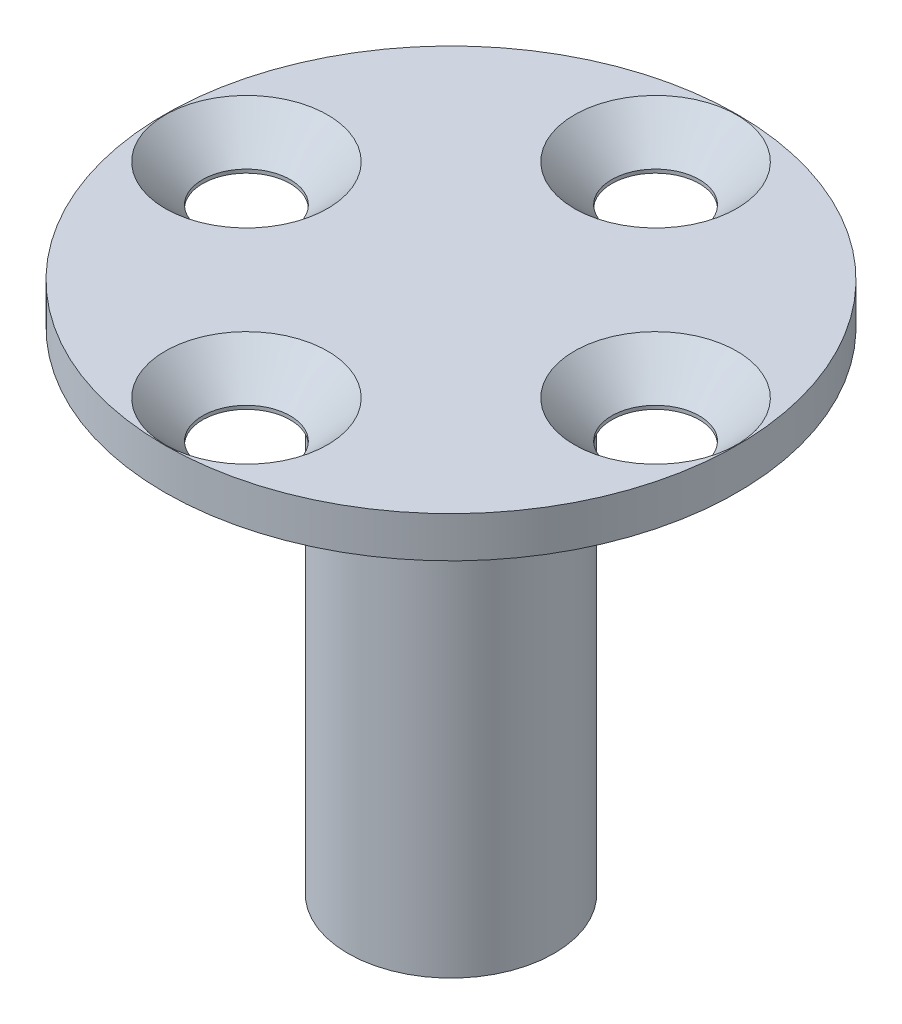
ISO-10303-21;
HEADER;
FILE_DESCRIPTION(('STEP AP214'),'2;1');
FILE_NAME('part.step','',(''),(''),'','','');
FILE_SCHEMA(('AUTOMOTIVE_DESIGN { 1 0 10303 214 1 1 1 1 }'));
ENDSEC;
DATA;
#1=APPLICATION_CONTEXT('core data for automotive mechanical design processes');
#2=APPLICATION_PROTOCOL_DEFINITION('international standard','automotive_design',2000,#1);
#3=PRODUCT_CONTEXT('',#1,'mechanical');
#4=PRODUCT('Part','Part','',(#3));
#5=PRODUCT_RELATED_PRODUCT_CATEGORY('part','',(#4));
#6=PRODUCT_DEFINITION_FORMATION('','',#4);
#7=PRODUCT_DEFINITION_CONTEXT('part definition',#1,'design');
#8=PRODUCT_DEFINITION('design','',#6,#7);
#9=PRODUCT_DEFINITION_SHAPE('','',#8);
#10=(LENGTH_UNIT() NAMED_UNIT(*) SI_UNIT(.MILLI.,.METRE.));
#11=(NAMED_UNIT(*) PLANE_ANGLE_UNIT() SI_UNIT($,.RADIAN.));
#12=(NAMED_UNIT(*) SI_UNIT($,.STERADIAN.) SOLID_ANGLE_UNIT());
#13=UNCERTAINTY_MEASURE_WITH_UNIT(LENGTH_MEASURE(1.E-05),#10,'distance_accuracy_value','');
#14=(GEOMETRIC_REPRESENTATION_CONTEXT(3) GLOBAL_UNCERTAINTY_ASSIGNED_CONTEXT((#13)) GLOBAL_UNIT_ASSIGNED_CONTEXT((#10,
#11,#12)) REPRESENTATION_CONTEXT('',''));
#15=CARTESIAN_POINT('',(0.,0.,0.));
#16=DIRECTION('',(0.,0.,1.));
#17=DIRECTION('',(1.,0.,0.));
#18=AXIS2_PLACEMENT_3D('',#15,#16,#17);
#19=CARTESIAN_POINT('',(0.,3.175,0.));
#20=DIRECTION('',(0.,-1.,0.));
#21=DIRECTION('',(0.,0.,-1.));
#22=AXIS2_PLACEMENT_3D('',#19,#20,#21);
#23=CYLINDRICAL_SURFACE('',#22,11.1125);
#24=CARTESIAN_POINT('',(0.,0.,0.));
#25=DIRECTION('',(0.,1.,0.));
#26=DIRECTION('',(0.,0.,1.));
#27=AXIS2_PLACEMENT_3D('',#24,#25,#26);
#28=CIRCLE('',#27,11.1125);
#29=CARTESIAN_POINT('',(0.,0.,11.1125));
#30=VERTEX_POINT('',#29);
#31=EDGE_CURVE('E41',#30,#30,#28,.T.);
#32=ORIENTED_EDGE('',*,*,#31,.T.);
#33=EDGE_LOOP('',(#32));
#34=FACE_BOUND('',#33,.T.);
#35=CARTESIAN_POINT('',(0.,1.5875,0.));
#36=DIRECTION('',(0.,1.,0.));
#37=DIRECTION('',(0.,0.,1.));
#38=AXIS2_PLACEMENT_3D('',#35,#36,#37);
#39=CIRCLE('',#38,11.1125);
#40=CARTESIAN_POINT('',(0.,1.5875,11.1125));
#41=VERTEX_POINT('',#40);
#42=EDGE_CURVE('E45',#41,#41,#39,.T.);
#43=ORIENTED_EDGE('',*,*,#42,.F.);
#44=EDGE_LOOP('',(#43));
#45=FACE_BOUND('',#44,.T.);
#46=ADVANCED_FACE('F30',(#34,#45),#23,.T.);
#47=CARTESIAN_POINT('',(0.,-19.05,0.));
#48=DIRECTION('',(0.,1.,0.));
#49=DIRECTION('',(0.,0.,1.));
#50=AXIS2_PLACEMENT_3D('',#47,#48,#49);
#51=CYLINDRICAL_SURFACE('',#50,4.);
#52=CARTESIAN_POINT('',(0.,-19.05,0.));
#53=DIRECTION('',(0.,1.,0.));
#54=DIRECTION('',(0.,0.,1.));
#55=AXIS2_PLACEMENT_3D('',#52,#53,#54);
#56=CIRCLE('',#55,4.);
#57=CARTESIAN_POINT('',(0.,-19.05,4.));
#58=VERTEX_POINT('',#57);
#59=EDGE_CURVE('E10',#58,#58,#56,.T.);
#60=CARTESIAN_POINT('',(0.,0.,0.));
#61=DIRECTION('',(0.,1.,0.));
#62=DIRECTION('',(0.,0.,1.));
#63=AXIS2_PLACEMENT_3D('',#60,#61,#62);
#64=CIRCLE('',#63,4.);
#65=CARTESIAN_POINT('',(0.,0.,4.));
#66=VERTEX_POINT('',#65);
#67=EDGE_CURVE('E34',#66,#66,#64,.T.);
#68=CARTESIAN_POINT('',(0.,-19.05,4.));
#69=CARTESIAN_POINT('',(0.,-18.8515625,4.));
#70=CARTESIAN_POINT('',(0.,-18.653125,4.));
#71=CARTESIAN_POINT('',(0.,-18.25625,4.));
#72=CARTESIAN_POINT('',(0.,-18.0578125,4.));
#73=CARTESIAN_POINT('',(0.,-17.6609375,4.));
#74=CARTESIAN_POINT('',(0.,-17.4625,4.));
#75=CARTESIAN_POINT('',(0.,-17.065625,4.));
#76=CARTESIAN_POINT('',(0.,-16.8671875,4.));
#77=CARTESIAN_POINT('',(0.,-16.4703125,4.));
#78=CARTESIAN_POINT('',(0.,-16.271875,4.));
#79=CARTESIAN_POINT('',(0.,-15.875,4.));
#80=CARTESIAN_POINT('',(0.,-15.6765625,4.));
#81=CARTESIAN_POINT('',(0.,-15.2796875,4.));
#82=CARTESIAN_POINT('',(0.,-15.08125,4.));
#83=CARTESIAN_POINT('',(0.,-14.684375,4.));
#84=CARTESIAN_POINT('',(0.,-14.4859375,4.));
#85=CARTESIAN_POINT('',(0.,-14.0890625,4.));
#86=CARTESIAN_POINT('',(0.,-13.890625,4.));
#87=CARTESIAN_POINT('',(0.,-13.49375,4.));
#88=CARTESIAN_POINT('',(0.,-13.2953125,4.));
#89=CARTESIAN_POINT('',(0.,-12.8984375,4.));
#90=CARTESIAN_POINT('',(0.,-12.7,4.));
#91=CARTESIAN_POINT('',(0.,-12.303125,4.));
#92=CARTESIAN_POINT('',(0.,-12.1046875,4.));
#93=CARTESIAN_POINT('',(0.,-11.7078125,4.));
#94=CARTESIAN_POINT('',(0.,-11.509375,4.));
#95=CARTESIAN_POINT('',(0.,-11.1125,4.));
#96=CARTESIAN_POINT('',(0.,-10.9140625,4.));
#97=CARTESIAN_POINT('',(0.,-10.5171875,4.));
#98=CARTESIAN_POINT('',(0.,-10.31875,4.));
#99=CARTESIAN_POINT('',(0.,-9.921875,4.));
#100=CARTESIAN_POINT('',(0.,-9.7234375,4.));
#101=CARTESIAN_POINT('',(0.,-9.3265625,4.));
#102=CARTESIAN_POINT('',(0.,-9.128125,4.));
#103=CARTESIAN_POINT('',(0.,-8.73125,4.));
#104=CARTESIAN_POINT('',(0.,-8.5328125,4.));
#105=CARTESIAN_POINT('',(0.,-8.1359375,4.));
#106=CARTESIAN_POINT('',(0.,-7.9375,4.));
#107=CARTESIAN_POINT('',(0.,-7.540625,4.));
#108=CARTESIAN_POINT('',(0.,-7.3421875,4.));
#109=CARTESIAN_POINT('',(0.,-6.9453125,4.));
#110=CARTESIAN_POINT('',(0.,-6.746875,4.));
#111=CARTESIAN_POINT('',(0.,-6.35,4.));
#112=CARTESIAN_POINT('',(0.,-6.1515625,4.));
#113=CARTESIAN_POINT('',(0.,-5.7546875,4.));
#114=CARTESIAN_POINT('',(0.,-5.55625,4.));
#115=CARTESIAN_POINT('',(0.,-5.159375,4.));
#116=CARTESIAN_POINT('',(0.,-4.9609375,4.));
#117=CARTESIAN_POINT('',(0.,-4.5640625,4.));
#118=CARTESIAN_POINT('',(0.,-4.365625,4.));
#119=CARTESIAN_POINT('',(0.,-3.96875,4.));
#120=CARTESIAN_POINT('',(0.,-3.7703125,4.));
#121=CARTESIAN_POINT('',(0.,-3.3734375,4.));
#122=CARTESIAN_POINT('',(0.,-3.175,4.));
#123=CARTESIAN_POINT('',(0.,-2.778125,4.));
#124=CARTESIAN_POINT('',(0.,-2.5796875,4.));
#125=CARTESIAN_POINT('',(0.,-2.1828125,4.));
#126=CARTESIAN_POINT('',(0.,-1.984375,4.));
#127=CARTESIAN_POINT('',(0.,-1.5875,4.));
#128=CARTESIAN_POINT('',(0.,-1.3890625,4.));
#129=CARTESIAN_POINT('',(0.,-0.992187500000001,4.));
#130=CARTESIAN_POINT('',(0.,-0.793750000000001,4.));
#131=CARTESIAN_POINT('',(0.,-0.396875,4.));
#132=CARTESIAN_POINT('',(0.,-0.1984375,4.));
#133=CARTESIAN_POINT('',(0.,0.,4.));
#134=B_SPLINE_CURVE_WITH_KNOTS('',3,(#68,#69,#70,#71,#72,#73,#74,#75,#76,#77,#78,#79,#80,#81,
#82,#83,#84,#85,#86,#87,#88,#89,#90,#91,#92,#93,#94,#95,#96,#97,#98,#99,#100,#101,#102,#103,
#104,#105,#106,#107,#108,#109,#110,#111,#112,#113,#114,#115,#116,#117,#118,#119,#120,#121,#122,
#123,#124,#125,#126,#127,#128,#129,#130,#131,#132,#133),.UNSPECIFIED.,.F.,.F.,(4,2,2,2,2,2,2,2,
2,2,2,2,2,2,2,2,2,2,2,2,2,2,2,2,2,2,2,2,2,2,2,2,4),(0.,0.5953125,1.190625,1.7859375,2.38125,
2.9765625,3.571875,4.1671875,4.7625,5.3578125,5.953125,6.5484375,7.14375,7.7390625,8.334375,
8.9296875,9.525,10.1203125,10.715625,11.3109375,11.90625,12.5015625,13.096875,13.6921875,
14.2875,14.8828125,15.478125,16.0734375,16.66875,17.2640625,17.859375,18.4546875,19.05),.UNSPECIFIED.);
#135=EDGE_CURVE('BSEAM32',#58,#66,#134,.T.);
#136=ORIENTED_EDGE('',*,*,#59,.T.);
#137=ORIENTED_EDGE('',*,*,#67,.F.);
#138=ORIENTED_EDGE('',*,*,#135,.T.);
#139=ORIENTED_EDGE('',*,*,#135,.F.);
#140=EDGE_LOOP('',(#136,#138,#137,#139));
#141=FACE_BOUND('',#140,.T.);
#142=ADVANCED_FACE('F32',(#141),#51,.T.);
#143=CARTESIAN_POINT('',(0.,-19.05,0.));
#144=DIRECTION('',(0.,1.,0.));
#145=DIRECTION('',(0.,0.,1.));
#146=AXIS2_PLACEMENT_3D('',#143,#144,#145);
#147=PLANE('',#146);
#148=ORIENTED_EDGE('',*,*,#59,.F.);
#149=EDGE_LOOP('',(#148));
#150=FACE_BOUND('',#149,.T.);
#151=ADVANCED_FACE('F107',(#150),#147,.F.);
#152=CARTESIAN_POINT('',(0.,0.,0.));
#153=DIRECTION('',(0.,1.,0.));
#154=DIRECTION('',(0.,0.,1.));
#155=AXIS2_PLACEMENT_3D('',#152,#153,#154);
#156=PLANE('',#155);
#157=CARTESIAN_POINT('',(7.9375,0.,0.));
#158=DIRECTION('',(0.,1.,0.));
#159=DIRECTION('',(0.,0.,1.));
#160=AXIS2_PLACEMENT_3D('',#157,#158,#159);
#161=CIRCLE('',#160,1.7);
#162=CARTESIAN_POINT('',(7.9375,0.,1.7));
#163=VERTEX_POINT('',#162);
#164=EDGE_CURVE('E75',#163,#163,#161,.T.);
#165=ORIENTED_EDGE('',*,*,#164,.T.);
#166=EDGE_LOOP('',(#165));
#167=FACE_BOUND('',#166,.T.);
#168=CARTESIAN_POINT('',(0.,0.,-7.9375));
#169=DIRECTION('',(0.,1.,0.));
#170=DIRECTION('',(0.,0.,1.));
#171=AXIS2_PLACEMENT_3D('',#168,#169,#170);
#172=CIRCLE('',#171,1.7);
#173=CARTESIAN_POINT('',(0.,0.,-6.2375));
#174=VERTEX_POINT('',#173);
#175=EDGE_CURVE('E66',#174,#174,#172,.T.);
#176=ORIENTED_EDGE('',*,*,#175,.T.);
#177=EDGE_LOOP('',(#176));
#178=FACE_BOUND('',#177,.T.);
#179=CARTESIAN_POINT('',(0.,0.,7.9375));
#180=DIRECTION('',(0.,1.,0.));
#181=DIRECTION('',(0.,0.,1.));
#182=AXIS2_PLACEMENT_3D('',#179,#180,#181);
#183=CIRCLE('',#182,1.7);
#184=CARTESIAN_POINT('',(0.,0.,9.6375));
#185=VERTEX_POINT('',#184);
#186=EDGE_CURVE('E57',#185,#185,#183,.T.);
#187=ORIENTED_EDGE('',*,*,#186,.T.);
#188=EDGE_LOOP('',(#187));
#189=FACE_BOUND('',#188,.T.);
#190=CARTESIAN_POINT('',(-7.9375,0.,0.));
#191=DIRECTION('',(0.,1.,0.));
#192=DIRECTION('',(0.,0.,1.));
#193=AXIS2_PLACEMENT_3D('',#190,#191,#192);
#194=CIRCLE('',#193,1.7);
#195=CARTESIAN_POINT('',(-7.9375,0.,1.7));
#196=VERTEX_POINT('',#195);
#197=EDGE_CURVE('E48',#196,#196,#194,.T.);
#198=ORIENTED_EDGE('',*,*,#197,.T.);
#199=EDGE_LOOP('',(#198));
#200=FACE_BOUND('',#199,.T.);
#201=ORIENTED_EDGE('',*,*,#67,.T.);
#202=EDGE_LOOP('',(#201));
#203=FACE_BOUND('',#202,.T.);
#204=ORIENTED_EDGE('',*,*,#31,.F.);
#205=EDGE_LOOP('',(#204));
#206=FACE_BOUND('',#205,.T.);
#207=ADVANCED_FACE('F91',(#167,#178,#189,#200,#203,#206),#156,.F.);
#208=CARTESIAN_POINT('',(0.,1.5875,0.));
#209=DIRECTION('',(0.,1.,0.));
#210=DIRECTION('',(0.,0.,1.));
#211=AXIS2_PLACEMENT_3D('',#208,#209,#210);
#212=PLANE('',#211);
#213=CARTESIAN_POINT('',(7.9375,1.5875,0.));
#214=DIRECTION('',(0.,1.,0.));
#215=DIRECTION('',(0.,0.,1.));
#216=AXIS2_PLACEMENT_3D('',#213,#214,#215);
#217=CIRCLE('',#216,3.15);
#218=CARTESIAN_POINT('',(7.9375,1.5875,3.15));
#219=VERTEX_POINT('',#218);
#220=EDGE_CURVE('E81',#219,#219,#217,.T.);
#221=ORIENTED_EDGE('',*,*,#220,.F.);
#222=EDGE_LOOP('',(#221));
#223=FACE_BOUND('',#222,.T.);
#224=CARTESIAN_POINT('',(0.,1.5875,-7.9375));
#225=DIRECTION('',(0.,1.,0.));
#226=DIRECTION('',(0.,0.,1.));
#227=AXIS2_PLACEMENT_3D('',#224,#225,#226);
#228=CIRCLE('',#227,3.15);
#229=CARTESIAN_POINT('',(0.,1.5875,-4.7875));
#230=VERTEX_POINT('',#229);
#231=EDGE_CURVE('E72',#230,#230,#228,.T.);
#232=ORIENTED_EDGE('',*,*,#231,.F.);
#233=EDGE_LOOP('',(#232));
#234=FACE_BOUND('',#233,.T.);
#235=CARTESIAN_POINT('',(0.,1.5875,7.9375));
#236=DIRECTION('',(0.,1.,0.));
#237=DIRECTION('',(0.,0.,1.));
#238=AXIS2_PLACEMENT_3D('',#235,#236,#237);
#239=CIRCLE('',#238,3.15);
#240=CARTESIAN_POINT('',(0.,1.5875,11.0875));
#241=VERTEX_POINT('',#240);
#242=EDGE_CURVE('E63',#241,#241,#239,.T.);
#243=ORIENTED_EDGE('',*,*,#242,.F.);
#244=EDGE_LOOP('',(#243));
#245=FACE_BOUND('',#244,.T.);
#246=CARTESIAN_POINT('',(-7.9375,1.5875,0.));
#247=DIRECTION('',(0.,1.,0.));
#248=DIRECTION('',(0.,0.,1.));
#249=AXIS2_PLACEMENT_3D('',#246,#247,#248);
#250=CIRCLE('',#249,3.15);
#251=CARTESIAN_POINT('',(-7.9375,1.5875,3.15));
#252=VERTEX_POINT('',#251);
#253=EDGE_CURVE('E54',#252,#252,#250,.T.);
#254=ORIENTED_EDGE('',*,*,#253,.F.);
#255=EDGE_LOOP('',(#254));
#256=FACE_BOUND('',#255,.T.);
#257=ORIENTED_EDGE('',*,*,#42,.T.);
#258=EDGE_LOOP('',(#257));
#259=FACE_BOUND('',#258,.T.);
#260=ADVANCED_FACE('F87',(#223,#234,#245,#256,#259),#212,.T.);
#261=CARTESIAN_POINT('',(-7.9375,1.5875,0.));
#262=DIRECTION('',(0.,1.,0.));
#263=DIRECTION('',(0.,0.,1.));
#264=AXIS2_PLACEMENT_3D('',#261,#262,#263);
#265=CYLINDRICAL_SURFACE('',#264,1.7);
#266=ORIENTED_EDGE('',*,*,#197,.F.);
#267=EDGE_LOOP('',(#266));
#268=FACE_BOUND('',#267,.T.);
#269=CARTESIAN_POINT('',(-7.9375,0.1375,0.));
#270=DIRECTION('',(0.,1.,0.));
#271=DIRECTION('',(0.,0.,1.));
#272=AXIS2_PLACEMENT_3D('',#269,#270,#271);
#273=CIRCLE('',#272,1.7);
#274=CARTESIAN_POINT('',(-7.9375,0.1375,1.7));
#275=VERTEX_POINT('',#274);
#276=EDGE_CURVE('E51',#275,#275,#273,.T.);
#277=ORIENTED_EDGE('',*,*,#276,.T.);
#278=EDGE_LOOP('',(#277));
#279=FACE_BOUND('',#278,.T.);
#280=ADVANCED_FACE('F90',(#268,#279),#265,.F.);
#281=CARTESIAN_POINT('',(-7.9375,1.5875,0.));
#282=DIRECTION('',(0.,1.,0.));
#283=DIRECTION('',(0.,0.,1.));
#284=AXIS2_PLACEMENT_3D('',#281,#282,#283);
#285=CONICAL_SURFACE('',#284,3.15,0.785398163397449);
#286=ORIENTED_EDGE('',*,*,#276,.F.);
#287=EDGE_LOOP('',(#286));
#288=FACE_BOUND('',#287,.T.);
#289=ORIENTED_EDGE('',*,*,#253,.T.);
#290=EDGE_LOOP('',(#289));
#291=FACE_BOUND('',#290,.T.);
#292=ADVANCED_FACE('F132',(#288,#291),#285,.F.);
#293=CARTESIAN_POINT('',(0.,1.5875,7.9375));
#294=DIRECTION('',(0.,1.,0.));
#295=DIRECTION('',(0.,0.,1.));
#296=AXIS2_PLACEMENT_3D('',#293,#294,#295);
#297=CYLINDRICAL_SURFACE('',#296,1.7);
#298=ORIENTED_EDGE('',*,*,#186,.F.);
#299=EDGE_LOOP('',(#298));
#300=FACE_BOUND('',#299,.T.);
#301=CARTESIAN_POINT('',(0.,0.1375,7.9375));
#302=DIRECTION('',(0.,1.,0.));
#303=DIRECTION('',(0.,0.,1.));
#304=AXIS2_PLACEMENT_3D('',#301,#302,#303);
#305=CIRCLE('',#304,1.7);
#306=CARTESIAN_POINT('',(0.,0.1375,9.6375));
#307=VERTEX_POINT('',#306);
#308=EDGE_CURVE('E60',#307,#307,#305,.T.);
#309=ORIENTED_EDGE('',*,*,#308,.T.);
#310=EDGE_LOOP('',(#309));
#311=FACE_BOUND('',#310,.T.);
#312=ADVANCED_FACE('F138',(#300,#311),#297,.F.);
#313=CARTESIAN_POINT('',(0.,1.5875,7.9375));
#314=DIRECTION('',(0.,1.,0.));
#315=DIRECTION('',(0.,0.,1.));
#316=AXIS2_PLACEMENT_3D('',#313,#314,#315);
#317=CONICAL_SURFACE('',#316,3.15,0.785398163397449);
#318=ORIENTED_EDGE('',*,*,#308,.F.);
#319=EDGE_LOOP('',(#318));
#320=FACE_BOUND('',#319,.T.);
#321=ORIENTED_EDGE('',*,*,#242,.T.);
#322=EDGE_LOOP('',(#321));
#323=FACE_BOUND('',#322,.T.);
#324=ADVANCED_FACE('F143',(#320,#323),#317,.F.);
#325=CARTESIAN_POINT('',(0.,1.5875,-7.9375));
#326=DIRECTION('',(0.,1.,0.));
#327=DIRECTION('',(0.,0.,1.));
#328=AXIS2_PLACEMENT_3D('',#325,#326,#327);
#329=CYLINDRICAL_SURFACE('',#328,1.7);
#330=ORIENTED_EDGE('',*,*,#175,.F.);
#331=EDGE_LOOP('',(#330));
#332=FACE_BOUND('',#331,.T.);
#333=CARTESIAN_POINT('',(0.,0.1375,-7.9375));
#334=DIRECTION('',(0.,1.,0.));
#335=DIRECTION('',(0.,0.,1.));
#336=AXIS2_PLACEMENT_3D('',#333,#334,#335);
#337=CIRCLE('',#336,1.7);
#338=CARTESIAN_POINT('',(0.,0.1375,-6.2375));
#339=VERTEX_POINT('',#338);
#340=EDGE_CURVE('E69',#339,#339,#337,.T.);
#341=ORIENTED_EDGE('',*,*,#340,.T.);
#342=EDGE_LOOP('',(#341));
#343=FACE_BOUND('',#342,.T.);
#344=ADVANCED_FACE('F149',(#332,#343),#329,.F.);
#345=CARTESIAN_POINT('',(0.,1.5875,-7.9375));
#346=DIRECTION('',(0.,1.,0.));
#347=DIRECTION('',(0.,0.,1.));
#348=AXIS2_PLACEMENT_3D('',#345,#346,#347);
#349=CONICAL_SURFACE('',#348,3.15,0.785398163397449);
#350=ORIENTED_EDGE('',*,*,#340,.F.);
#351=EDGE_LOOP('',(#350));
#352=FACE_BOUND('',#351,.T.);
#353=ORIENTED_EDGE('',*,*,#231,.T.);
#354=EDGE_LOOP('',(#353));
#355=FACE_BOUND('',#354,.T.);
#356=ADVANCED_FACE('F153',(#352,#355),#349,.F.);
#357=CARTESIAN_POINT('',(7.9375,1.5875,0.));
#358=DIRECTION('',(0.,1.,0.));
#359=DIRECTION('',(0.,0.,1.));
#360=AXIS2_PLACEMENT_3D('',#357,#358,#359);
#361=CYLINDRICAL_SURFACE('',#360,1.7);
#362=ORIENTED_EDGE('',*,*,#164,.F.);
#363=EDGE_LOOP('',(#362));
#364=FACE_BOUND('',#363,.T.);
#365=CARTESIAN_POINT('',(7.9375,0.1375,0.));
#366=DIRECTION('',(0.,1.,0.));
#367=DIRECTION('',(0.,0.,1.));
#368=AXIS2_PLACEMENT_3D('',#365,#366,#367);
#369=CIRCLE('',#368,1.7);
#370=CARTESIAN_POINT('',(7.9375,0.1375,1.7));
#371=VERTEX_POINT('',#370);
#372=EDGE_CURVE('E78',#371,#371,#369,.T.);
#373=ORIENTED_EDGE('',*,*,#372,.T.);
#374=EDGE_LOOP('',(#373));
#375=FACE_BOUND('',#374,.T.);
#376=ADVANCED_FACE('F157',(#364,#375),#361,.F.);
#377=CARTESIAN_POINT('',(7.9375,1.5875,0.));
#378=DIRECTION('',(0.,1.,0.));
#379=DIRECTION('',(0.,0.,1.));
#380=AXIS2_PLACEMENT_3D('',#377,#378,#379);
#381=CONICAL_SURFACE('',#380,3.15,0.785398163397448);
#382=ORIENTED_EDGE('',*,*,#372,.F.);
#383=EDGE_LOOP('',(#382));
#384=FACE_BOUND('',#383,.T.);
#385=ORIENTED_EDGE('',*,*,#220,.T.);
#386=EDGE_LOOP('',(#385));
#387=FACE_BOUND('',#386,.T.);
#388=ADVANCED_FACE('F85',(#384,#387),#381,.F.);
#389=CLOSED_SHELL('',(#46,#142,#151,#207,#260,#280,#292,#312,#324,#344,#356,#376,#388));
#390=MANIFOLD_SOLID_BREP('B2',#389);
#391=ADVANCED_BREP_SHAPE_REPRESENTATION('',(#18,#390),#14);
#392=SHAPE_DEFINITION_REPRESENTATION(#9,#391);
ENDSEC;
END-ISO-10303-21;
